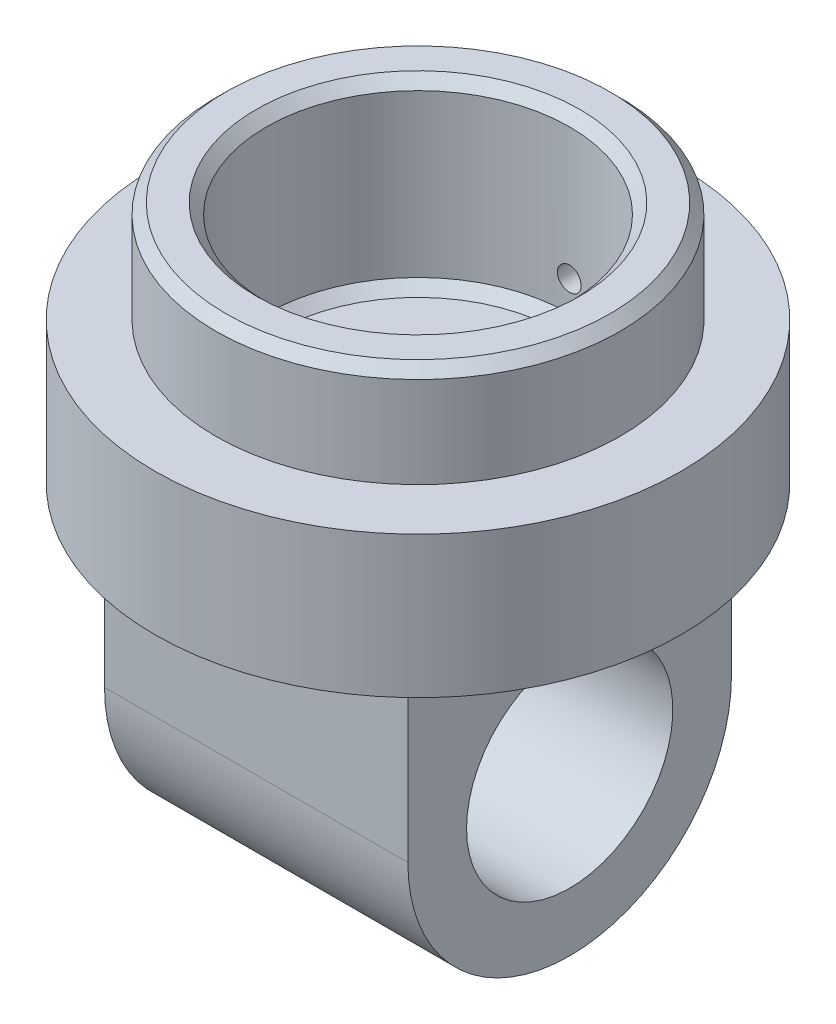
ISO-10303-21;
HEADER;
FILE_DESCRIPTION(('STEP AP214'),'2;1');
FILE_NAME('part.step','',(''),(''),'','','');
FILE_SCHEMA(('AUTOMOTIVE_DESIGN { 1 0 10303 214 1 1 1 1 }'));
ENDSEC;
DATA;
#1=APPLICATION_CONTEXT('core data for automotive mechanical design processes');
#2=APPLICATION_PROTOCOL_DEFINITION('international standard','automotive_design',2000,#1);
#3=PRODUCT_CONTEXT('',#1,'mechanical');
#4=PRODUCT('Part','Part','',(#3));
#5=PRODUCT_RELATED_PRODUCT_CATEGORY('part','',(#4));
#6=PRODUCT_DEFINITION_FORMATION('','',#4);
#7=PRODUCT_DEFINITION_CONTEXT('part definition',#1,'design');
#8=PRODUCT_DEFINITION('design','',#6,#7);
#9=PRODUCT_DEFINITION_SHAPE('','',#8);
#10=(LENGTH_UNIT() NAMED_UNIT(*) SI_UNIT(.MILLI.,.METRE.));
#11=(NAMED_UNIT(*) PLANE_ANGLE_UNIT() SI_UNIT($,.RADIAN.));
#12=(NAMED_UNIT(*) SI_UNIT($,.STERADIAN.) SOLID_ANGLE_UNIT());
#13=UNCERTAINTY_MEASURE_WITH_UNIT(LENGTH_MEASURE(1.E-05),#10,'distance_accuracy_value','');
#14=(GEOMETRIC_REPRESENTATION_CONTEXT(3) GLOBAL_UNCERTAINTY_ASSIGNED_CONTEXT((#13)) GLOBAL_UNIT_ASSIGNED_CONTEXT((#10,
#11,#12)) REPRESENTATION_CONTEXT('',''));
#15=CARTESIAN_POINT('',(0.,0.,0.));
#16=DIRECTION('',(0.,0.,1.));
#17=DIRECTION('',(1.,0.,0.));
#18=AXIS2_PLACEMENT_3D('',#15,#16,#17);
#19=CARTESIAN_POINT('',(0.,5.,-13.));
#20=DIRECTION('',(0.,0.,1.));
#21=DIRECTION('',(1.,0.,0.));
#22=AXIS2_PLACEMENT_3D('',#19,#20,#21);
#23=CYLINDRICAL_SURFACE('',#22,0.585);
#24=CARTESIAN_POINT('',(0.585,5.,-7.47715019241957));
#25=CARTESIAN_POINT('',(0.584998563795285,4.96719396278517,-7.47715049601209));
#26=CARTESIAN_POINT('',(0.582231139372127,4.93436541118221,-7.4773684210632));
#27=CARTESIAN_POINT('',(0.571231802858389,4.86961610780288,-7.47821659753848));
#28=CARTESIAN_POINT('',(0.562993651263335,4.83769643602828,-7.47884731975653));
#29=CARTESIAN_POINT('',(0.541292103546525,4.77571208378763,-7.48044922027061));
#30=CARTESIAN_POINT('',(0.527831611918575,4.74564638295718,-7.48142020929243));
#31=CARTESIAN_POINT('',(0.496072517566811,4.68820846464228,-7.48359299933171));
#32=CARTESIAN_POINT('',(0.477774969942067,4.66083566154501,-7.48479474999788));
#33=CARTESIAN_POINT('',(0.436816239470741,4.60949117617843,-7.48729671767479));
#34=CARTESIAN_POINT('',(0.414146372600511,4.58552643014494,-7.48859712746483));
#35=CARTESIAN_POINT('',(0.365104802897204,4.54173786788711,-7.49114811757688));
#36=CARTESIAN_POINT('',(0.338732940515813,4.52191423022762,-7.49239869574826));
#37=CARTESIAN_POINT('',(0.282995089212754,4.48694790918832,-7.49471090735017));
#38=CARTESIAN_POINT('',(0.253625360276622,4.4718111702842,-7.49577230011578));
#39=CARTESIAN_POINT('',(0.192751599788879,4.44668635189898,-7.49758448246524));
#40=CARTESIAN_POINT('',(0.161247601485989,4.43669819223158,-7.49833527688645));
#41=CARTESIAN_POINT('',(0.0970681601773989,4.42217386934481,-7.49944032397663));
#42=CARTESIAN_POINT('',(0.0643952540049419,4.41762655912719,-7.49979538730124));
#43=CARTESIAN_POINT('',(-0.00125186339859196,4.41407856704011,-7.50007170918446));
#44=CARTESIAN_POINT('',(-0.0342260696415574,4.41507779351161,-7.49999297491177));
#45=CARTESIAN_POINT('',(-0.0994642110645401,4.42258537328682,-7.49941124366731));
#46=CARTESIAN_POINT('',(-0.131729535151986,4.42908173896341,-7.49890916988167));
#47=CARTESIAN_POINT('',(-0.194710403933045,4.44738055976857,-7.49753830831495));
#48=CARTESIAN_POINT('',(-0.22542593543667,4.45918306004817,-7.4966695174134));
#49=CARTESIAN_POINT('',(-0.284473561064536,4.48777254166519,-7.49466139437315));
#50=CARTESIAN_POINT('',(-0.312803036686301,4.50456490980956,-7.49352177012418));
#51=CARTESIAN_POINT('',(-0.366245797581722,4.5426535408935,-7.4911001030236));
#52=CARTESIAN_POINT('',(-0.391359025819591,4.5639498836872,-7.48981805764709));
#53=CARTESIAN_POINT('',(-0.437726475075463,4.6105095420763,-7.48725165718064));
#54=CARTESIAN_POINT('',(-0.458970241329485,4.63578327082661,-7.48596730503178));
#55=CARTESIAN_POINT('',(-0.496915009654786,4.68954392925423,-7.48354449021343));
#56=CARTESIAN_POINT('',(-0.513616008619305,4.71803086112901,-7.4824060276437));
#57=CARTESIAN_POINT('',(-0.542000666539202,4.7774164308878,-7.48040364953063));
#58=CARTESIAN_POINT('',(-0.553683811896478,4.80831531526282,-7.47953976209354));
#59=CARTESIAN_POINT('',(-0.571693529135726,4.87164431182625,-7.47818485904934));
#60=CARTESIAN_POINT('',(-0.578020199514677,4.90407439584677,-7.47769383658584));
#61=CARTESIAN_POINT('',(-0.585124200386677,4.96945381907611,-7.47714133815574));
#62=CARTESIAN_POINT('',(-0.585916096986432,5.00240156643901,-7.4770787347091));
#63=CARTESIAN_POINT('',(-0.581966199328443,5.06796136381919,-7.4773871850025));
#64=CARTESIAN_POINT('',(-0.577224450201451,5.1005734165721,-7.47775823520578));
#65=CARTESIAN_POINT('',(-0.562353992882,5.16449444960116,-7.47889115473768));
#66=CARTESIAN_POINT('',(-0.552232057081079,5.19580501483873,-7.47965253269264));
#67=CARTESIAN_POINT('',(-0.526895428319861,5.25628332857806,-7.48147990678558));
#68=CARTESIAN_POINT('',(-0.511680663625552,5.28545104689012,-7.48254590721425));
#69=CARTESIAN_POINT('',(-0.476553306658331,5.34088243029676,-7.48486514535042));
#70=CARTESIAN_POINT('',(-0.456630992653969,5.36713991827515,-7.4861187685336));
#71=CARTESIAN_POINT('',(-0.41266812947916,5.41594311452501,-7.48867068030448));
#72=CARTESIAN_POINT('',(-0.388627518133201,5.43848876674739,-7.4899689695663));
#73=CARTESIAN_POINT('',(-0.337047611376138,5.47927787644979,-7.49246726770844));
#74=CARTESIAN_POINT('',(-0.309500828330164,5.49751188073007,-7.49366705694061));
#75=CARTESIAN_POINT('',(-0.251727933576654,5.52909528698747,-7.49583000857807));
#76=CARTESIAN_POINT('',(-0.221501845780548,5.54244473255134,-7.49679317309484));
#77=CARTESIAN_POINT('',(-0.159262470987015,5.56386378520704,-7.49837333275254));
#78=CARTESIAN_POINT('',(-0.127251219223727,5.57193927667544,-7.49899071358919));
#79=CARTESIAN_POINT('',(-0.0623221779357502,5.58260042688211,-7.49981130281043));
#80=CARTESIAN_POINT('',(-0.0294044032425068,5.585186175383,-7.50001451796704));
#81=CARTESIAN_POINT('',(0.0363099851482544,5.58479344855289,-7.49998389270456));
#82=CARTESIAN_POINT('',(0.0691066885431331,5.58182972250687,-7.49975121080337));
#83=CARTESIAN_POINT('',(0.133735108955002,5.57045288396941,-7.49887723333228));
#84=CARTESIAN_POINT('',(0.165566824535047,5.56203976336379,-7.49823593715395));
#85=CARTESIAN_POINT('',(0.227362969035672,5.54000659560835,-7.4966167189163));
#86=CARTESIAN_POINT('',(0.257327474332442,5.52638676159623,-7.49563881063642));
#87=CARTESIAN_POINT('',(0.314546876597952,5.49432853991922,-7.4934558827479));
#88=CARTESIAN_POINT('',(0.341801824113657,5.47589024216634,-7.49225086737718));
#89=CARTESIAN_POINT('',(0.392903821702217,5.43466322747998,-7.48974524877395));
#90=CARTESIAN_POINT('',(0.4167420891445,5.41186363858421,-7.48844441176582));
#91=CARTESIAN_POINT('',(0.460262523422789,5.36257997428967,-7.48589573764675));
#92=CARTESIAN_POINT('',(0.479943679462487,5.33609500538625,-7.48464791348461));
#93=CARTESIAN_POINT('',(0.514614370725447,5.28014706505876,-7.48234424556571));
#94=CARTESIAN_POINT('',(0.529595915028532,5.25067913289098,-7.48128873006177));
#95=CARTESIAN_POINT('',(0.554379609608873,5.18965831286628,-7.47949323705187));
#96=CARTESIAN_POINT('',(0.564187746256534,5.15810788255394,-7.47875289503752));
#97=CARTESIAN_POINT('',(0.575833632566769,5.10530776060821,-7.47786300645963));
#98=CARTESIAN_POINT('',(0.57926648651238,5.08439816662237,-7.47759692020826));
#99=CARTESIAN_POINT('',(0.583850130981975,5.04232883960955,-7.47724041543905));
#100=CARTESIAN_POINT('',(0.585000926755381,5.02116910715808,-7.47714999651713));
#101=CARTESIAN_POINT('',(0.585,5.,-7.47715019241957));
#102=B_SPLINE_CURVE_WITH_KNOTS('',3,(#24,#25,#26,#27,#28,#29,#30,#31,#32,#33,#34,#35,#36,#37,
#38,#39,#40,#41,#42,#43,#44,#45,#46,#47,#48,#49,#50,#51,#52,#53,#54,#55,#56,#57,#58,#59,#60,#61,
#62,#63,#64,#65,#66,#67,#68,#69,#70,#71,#72,#73,#74,#75,#76,#77,#78,#79,#80,#81,#82,#83,#84,#85,
#86,#87,#88,#89,#90,#91,#92,#93,#94,#95,#96,#97,#98,#99,#100,#101),.UNSPECIFIED.,.T.,.F.,(4,2,2,
2,2,2,2,2,2,2,2,2,2,2,2,2,2,2,2,2,2,2,2,2,2,2,2,2,2,2,2,2,2,2,2,2,2,2,4),(0.,0.098340822740405,
0.196793998783467,0.295192496720406,0.393569548839726,0.492144041665833,0.590722784152766,
0.68942604843554,0.788127775422642,0.886626938033285,0.985124472905173,1.08340776582575,
1.18169189507559,1.28008251473392,1.37847487897491,1.47712926542254,1.5757837193389,
1.6744482685423,1.77311100342357,1.87151398515881,1.96991616435449,2.06819477063224,
2.16647476125168,2.26495951514735,2.36344575603614,2.46214596436389,2.56084529193126,
2.65943430743485,2.75802171090004,2.85634746254026,2.9546733605884,3.05299523407991,
3.15131527302659,3.24988367883601,3.34847602390764,3.44723511166536,3.54587966897175,
3.60933726336905,3.67279471179456),.UNSPECIFIED.);
#103=CARTESIAN_POINT('',(0.585,5.,-7.47715019241957));
#104=VERTEX_POINT('',#103);
#105=EDGE_CURVE('E127',#104,#104,#102,.T.);
#106=ORIENTED_EDGE('',*,*,#105,.F.);
#107=EDGE_LOOP('',(#106));
#108=FACE_BOUND('',#107,.T.);
#109=CARTESIAN_POINT('',(0.,5.,-12.));
#110=DIRECTION('',(0.,0.,-1.));
#111=DIRECTION('',(-1.,0.,0.));
#112=AXIS2_PLACEMENT_3D('',#109,#110,#111);
#113=CIRCLE('',#112,0.585);
#114=CARTESIAN_POINT('',(-0.585,5.,-12.));
#115=VERTEX_POINT('',#114);
#116=EDGE_CURVE('E233',#115,#115,#113,.F.);
#117=ORIENTED_EDGE('',*,*,#116,.F.);
#118=EDGE_LOOP('',(#117));
#119=FACE_BOUND('',#118,.T.);
#120=ADVANCED_FACE('F41',(#108,#119),#23,.F.);
#121=CARTESIAN_POINT('',(0.,0.,0.));
#122=DIRECTION('',(0.,1.,0.));
#123=DIRECTION('',(0.,0.,1.));
#124=AXIS2_PLACEMENT_3D('',#121,#122,#123);
#125=PLANE('',#124);
#126=CARTESIAN_POINT('',(0.,0.,0.));
#127=DIRECTION('',(0.,1.,0.));
#128=DIRECTION('',(0.,0.,1.));
#129=AXIS2_PLACEMENT_3D('',#126,#127,#128);
#130=CIRCLE('',#129,13.);
#131=CARTESIAN_POINT('',(0.,0.,13.));
#132=VERTEX_POINT('',#131);
#133=EDGE_CURVE('E135',#132,#132,#130,.T.);
#134=ORIENTED_EDGE('',*,*,#133,.F.);
#135=EDGE_LOOP('',(#134));
#136=FACE_BOUND('',#135,.T.);
#137=DIRECTION('',(0.,0.,1.));
#138=VECTOR('',#137,1.);
#139=CARTESIAN_POINT('',(7.5,0.,-8.));
#140=LINE('',#139,#138);
#141=CARTESIAN_POINT('',(7.5,0.,-8.));
#142=VERTEX_POINT('',#141);
#143=CARTESIAN_POINT('',(7.5,0.,8.));
#144=VERTEX_POINT('',#143);
#145=EDGE_CURVE('E116',#142,#144,#140,.T.);
#146=ORIENTED_EDGE('',*,*,#145,.F.);
#147=DIRECTION('',(1.,0.,0.));
#148=VECTOR('',#147,1.);
#149=CARTESIAN_POINT('',(-7.5,0.,-8.));
#150=LINE('',#149,#148);
#151=CARTESIAN_POINT('',(-7.5,0.,-8.));
#152=VERTEX_POINT('',#151);
#153=EDGE_CURVE('E113',#152,#142,#150,.T.);
#154=ORIENTED_EDGE('',*,*,#153,.F.);
#155=DIRECTION('',(0.,0.,-1.));
#156=VECTOR('',#155,1.);
#157=CARTESIAN_POINT('',(-7.5,0.,-8.));
#158=LINE('',#157,#156);
#159=CARTESIAN_POINT('',(-7.5,0.,8.));
#160=VERTEX_POINT('',#159);
#161=EDGE_CURVE('E95',#160,#152,#158,.T.);
#162=ORIENTED_EDGE('',*,*,#161,.F.);
#163=DIRECTION('',(-1.,0.,0.));
#164=VECTOR('',#163,1.);
#165=CARTESIAN_POINT('',(-7.5,0.,8.));
#166=LINE('',#165,#164);
#167=EDGE_CURVE('E110',#144,#160,#166,.T.);
#168=ORIENTED_EDGE('',*,*,#167,.F.);
#169=EDGE_LOOP('',(#146,#154,#162,#168));
#170=FACE_BOUND('',#169,.T.);
#171=ADVANCED_FACE('F109',(#136,#170),#125,.F.);
#172=CARTESIAN_POINT('',(0.,7.,0.));
#173=DIRECTION('',(0.,-1.,0.));
#174=DIRECTION('',(0.,0.,-1.));
#175=AXIS2_PLACEMENT_3D('',#172,#173,#174);
#176=CYLINDRICAL_SURFACE('',#175,13.);
#177=CARTESIAN_POINT('',(0.,6.17,-13.));
#178=CARTESIAN_POINT('',(-0.0655770733831909,6.16999714463803,-12.999999314236));
#179=CARTESIAN_POINT('',(-0.131198302899322,6.16446817591332,-12.9994985222906));
#180=CARTESIAN_POINT('',(-0.260623766917359,6.14249421673751,-12.9975489156898));
#181=CARTESIAN_POINT('',(-0.324425880600931,6.12603698802158,-12.9960990382049));
#182=CARTESIAN_POINT('',(-0.448319998288958,6.08268748780169,-12.9924150364232));
#183=CARTESIAN_POINT('',(-0.508414131798482,6.0558012715841,-12.9901813672838));
#184=CARTESIAN_POINT('',(-0.623222676995861,5.99236818742624,-12.9851799994247));
#185=CARTESIAN_POINT('',(-0.677938205469778,5.95582333079415,-12.9824124119202));
#186=CARTESIAN_POINT('',(-0.780611480619449,5.87399437632325,-12.9766444441258));
#187=CARTESIAN_POINT('',(-0.828551176912478,5.82868766965657,-12.9736434738648));
#188=CARTESIAN_POINT('',(-0.916156970299005,5.73066908268457,-12.967751891193));
#189=CARTESIAN_POINT('',(-0.955822696815038,5.67795687087576,-12.96486128373));
#190=CARTESIAN_POINT('',(-1.02581688398996,5.5665127284956,-12.9595115069757));
#191=CARTESIAN_POINT('',(-1.05612928318576,5.50777067143939,-12.9570530829061));
#192=CARTESIAN_POINT('',(-1.10645378005146,5.38600474476321,-12.9528530245998));
#193=CARTESIAN_POINT('',(-1.12646608698249,5.32298096216208,-12.9511113758008));
#194=CARTESIAN_POINT('',(-1.1555694772364,5.19462285929898,-12.948547187062));
#195=CARTESIAN_POINT('',(-1.1646901978388,5.12929530951493,-12.947722153334));
#196=CARTESIAN_POINT('',(-1.17184309151239,4.99803178014403,-12.9470767876856));
#197=CARTESIAN_POINT('',(-1.16987550416455,4.93209581373376,-12.9472564340574));
#198=CARTESIAN_POINT('',(-1.15493210247322,4.80169068514305,-12.9485978596503));
#199=CARTESIAN_POINT('',(-1.14198855429366,4.73721779175373,-12.949756760111));
#200=CARTESIAN_POINT('',(-1.10551080863555,4.61136328494423,-12.952921607578));
#201=CARTESIAN_POINT('',(-1.08197649266668,4.54998170611845,-12.9549275640612));
#202=CARTESIAN_POINT('',(-1.02494933105865,4.43194973891682,-12.9595638174632));
#203=CARTESIAN_POINT('',(-0.991442069999227,4.37530635224795,-12.9621950170235));
#204=CARTESIAN_POINT('',(-0.915430545044213,4.26843525422681,-12.9677844822666));
#205=CARTESIAN_POINT('',(-0.872926068212017,4.21820769476268,-12.9707427556894));
#206=CARTESIAN_POINT('',(-0.779945972441402,4.12540645919818,-12.976665862664));
#207=CARTESIAN_POINT('',(-0.729442469817794,4.08286071461127,-12.9796306819926));
#208=CARTESIAN_POINT('',(-0.62199503724684,4.00684698720526,-12.985222806261));
#209=CARTESIAN_POINT('',(-0.565051101993916,3.97337901186444,-12.9878501109228));
#210=CARTESIAN_POINT('',(-0.446320624902194,3.91647236065178,-12.9924718121985));
#211=CARTESIAN_POINT('',(-0.384533454087613,3.89303498998468,-12.9944661264377));
#212=CARTESIAN_POINT('',(-0.257879048814398,3.85687475046419,-12.9975962422317));
#213=CARTESIAN_POINT('',(-0.193011888968761,3.84415162219712,-12.9987320645724));
#214=CARTESIAN_POINT('',(-0.0622808689777487,3.82981620693082,-13.0000145526394));
#215=CARTESIAN_POINT('',(0.00357872987152009,3.8281653534085,-13.0001646517608));
#216=CARTESIAN_POINT('',(0.134637718246366,3.83592021890556,-12.9994679651337));
#217=CARTESIAN_POINT('',(0.199837114963923,3.84532581734936,-12.9986211902565));
#218=CARTESIAN_POINT('',(0.327614451463973,3.87489461952363,-12.9960281600999));
#219=CARTESIAN_POINT('',(0.390196576879883,3.89503987834021,-12.994283405424));
#220=CARTESIAN_POINT('',(0.511092719713829,3.94549778027639,-12.9900903142734));
#221=CARTESIAN_POINT('',(0.569406658836038,3.97581060985352,-12.987641964896));
#222=CARTESIAN_POINT('',(0.680286190275396,4.04583961951891,-12.9823073579382));
#223=CARTESIAN_POINT('',(0.732835638774416,4.08558126953814,-12.9794199219806));
#224=CARTESIAN_POINT('',(0.830531369434532,4.17330311177066,-12.9735352777719));
#225=CARTESIAN_POINT('',(0.875677501438012,4.22128347104501,-12.9705380672957));
#226=CARTESIAN_POINT('',(0.957417969510042,4.32428845242655,-12.964761449726));
#227=CARTESIAN_POINT('',(0.993987083606716,4.37933313168645,-12.9619827005918));
#228=CARTESIAN_POINT('',(1.0573623458457,4.49480474607628,-12.9569672303592));
#229=CARTESIAN_POINT('',(1.0841686052662,4.55523161984954,-12.9547305030828));
#230=CARTESIAN_POINT('',(1.12721454207078,4.67966408330323,-12.951056197325));
#231=CARTESIAN_POINT('',(1.14346949516793,4.7436643530296,-12.9496174639847));
#232=CARTESIAN_POINT('',(1.16500107270786,4.87349934087947,-12.9476982974025));
#233=CARTESIAN_POINT('',(1.17027794712972,4.93933401719756,-12.9472178423398));
#234=CARTESIAN_POINT('',(1.16970047241508,5.07071835277752,-12.9472700073517));
#235=CARTESIAN_POINT('',(1.16388574835812,5.13626819126233,-12.9477990210702));
#236=CARTESIAN_POINT('',(1.14137293444024,5.2654560989954,-12.9498028449673));
#237=CARTESIAN_POINT('',(1.12467482948631,5.3290941655923,-12.9512776564576));
#238=CARTESIAN_POINT('',(1.08087963991472,5.45265354467565,-12.9550059342678));
#239=CARTESIAN_POINT('',(1.05378344483382,5.51257517458694,-12.9572593339792));
#240=CARTESIAN_POINT('',(0.989965512303128,5.62702572055137,-12.9622910133378));
#241=CARTESIAN_POINT('',(0.953243888988549,5.68155470053826,-12.9650692867609));
#242=CARTESIAN_POINT('',(0.871068509293346,5.78387504008517,-12.9708495182612));
#243=CARTESIAN_POINT('',(0.825585317251323,5.8316427181198,-12.9738522088748));
#244=CARTESIAN_POINT('',(0.727233598178512,5.91888674916551,-12.9797362407685));
#245=CARTESIAN_POINT('',(0.674363293806584,5.9583611010606,-12.9826175526272));
#246=CARTESIAN_POINT('',(0.562619947439171,6.02796024433651,-12.9879402478007));
#247=CARTESIAN_POINT('',(0.503734496133181,6.05806516711066,-12.9903806916874));
#248=CARTESIAN_POINT('',(0.381761733659473,6.10792108476435,-12.9945360190333));
#249=CARTESIAN_POINT('',(0.318679310821353,6.12768389542245,-12.9962517300596));
#250=CARTESIAN_POINT('',(0.212691935250171,6.15130111564081,-12.998327353203));
#251=CARTESIAN_POINT('',(0.170467113841784,6.15830377913045,-12.998951714113));
#252=CARTESIAN_POINT('',(0.0855011185890151,6.16765414481968,-12.999788260433));
#253=CARTESIAN_POINT('',(0.0427599463909341,6.17000186185687,-13.0000004471568));
#254=CARTESIAN_POINT('',(0.,6.17,-13.));
#255=B_SPLINE_CURVE_WITH_KNOTS('',3,(#177,#178,#179,#180,#181,#182,#183,#184,#185,#186,#187,
#188,#189,#190,#191,#192,#193,#194,#195,#196,#197,#198,#199,#200,#201,#202,#203,#204,#205,#206,
#207,#208,#209,#210,#211,#212,#213,#214,#215,#216,#217,#218,#219,#220,#221,#222,#223,#224,#225,
#226,#227,#228,#229,#230,#231,#232,#233,#234,#235,#236,#237,#238,#239,#240,#241,#242,#243,#244,
#245,#246,#247,#248,#249,#250,#251,#252,#253,#254),.UNSPECIFIED.,.T.,.F.,(4,2,2,2,2,2,2,2,2,2,2,
2,2,2,2,2,2,2,2,2,2,2,2,2,2,2,2,2,2,2,2,2,2,2,2,2,2,2,4),(0.,0.196575091084147,
0.393370693426118,0.590052202786204,0.786692787559258,0.983847716607804,1.18101147400549,
1.37851193917929,1.5760083916898,1.7729661996821,1.96991975209613,2.16629631697522,
2.36267507898464,2.55933908725317,2.75600775047832,2.95337771093226,3.15074783397924,
3.34814363146557,3.54553464945914,3.74223776393614,3.93893873329721,4.13531206014359,
4.33168898836988,4.5286025507387,4.72552010650896,4.92300966343918,5.12049696928921,
5.3176977202968,5.51489398084648,5.7113870708348,5.90788043331892,6.10435698991686,
6.30083121686481,6.49797741525511,6.69517112901493,6.8927802022428,7.09016301309279,
7.21834145588702,7.34651949011302),.UNSPECIFIED.);
#256=CARTESIAN_POINT('',(0.,6.17,-13.));
#257=VERTEX_POINT('',#256);
#258=EDGE_CURVE('E11',#257,#257,#255,.T.);
#259=ORIENTED_EDGE('',*,*,#258,.T.);
#260=EDGE_LOOP('',(#259));
#261=FACE_BOUND('',#260,.T.);
#262=CARTESIAN_POINT('',(0.,7.,0.));
#263=DIRECTION('',(0.,1.,0.));
#264=DIRECTION('',(0.,0.,1.));
#265=AXIS2_PLACEMENT_3D('',#262,#263,#264);
#266=CIRCLE('',#265,13.);
#267=CARTESIAN_POINT('',(0.,7.,13.));
#268=VERTEX_POINT('',#267);
#269=EDGE_CURVE('E132',#268,#268,#266,.T.);
#270=ORIENTED_EDGE('',*,*,#269,.F.);
#271=EDGE_LOOP('',(#270));
#272=FACE_BOUND('',#271,.T.);
#273=ORIENTED_EDGE('',*,*,#133,.T.);
#274=EDGE_LOOP('',(#273));
#275=FACE_BOUND('',#274,.T.);
#276=ADVANCED_FACE('F278',(#261,#272,#275),#176,.T.);
#277=CARTESIAN_POINT('',(0.,7.,0.));
#278=DIRECTION('',(0.,1.,0.));
#279=DIRECTION('',(0.,0.,1.));
#280=AXIS2_PLACEMENT_3D('',#277,#278,#279);
#281=PLANE('',#280);
#282=CARTESIAN_POINT('',(0.,7.,0.));
#283=DIRECTION('',(0.,1.,0.));
#284=DIRECTION('',(0.,0.,1.));
#285=AXIS2_PLACEMENT_3D('',#282,#283,#284);
#286=CIRCLE('',#285,10.);
#287=CARTESIAN_POINT('',(0.,7.,10.));
#288=VERTEX_POINT('',#287);
#289=EDGE_CURVE('E128',#288,#288,#286,.T.);
#290=ORIENTED_EDGE('',*,*,#289,.F.);
#291=EDGE_LOOP('',(#290));
#292=FACE_BOUND('',#291,.T.);
#293=ORIENTED_EDGE('',*,*,#269,.T.);
#294=EDGE_LOOP('',(#293));
#295=FACE_BOUND('',#294,.T.);
#296=ADVANCED_FACE('F281',(#292,#295),#281,.T.);
#297=CARTESIAN_POINT('',(0.,12.,0.));
#298=DIRECTION('',(0.,-1.,0.));
#299=DIRECTION('',(0.,0.,-1.));
#300=AXIS2_PLACEMENT_3D('',#297,#298,#299);
#301=CYLINDRICAL_SURFACE('',#300,10.);
#302=CARTESIAN_POINT('',(0.,11.5,0.));
#303=DIRECTION('',(0.,1.,0.));
#304=DIRECTION('',(0.,0.,1.));
#305=AXIS2_PLACEMENT_3D('',#302,#303,#304);
#306=CIRCLE('',#305,10.);
#307=CARTESIAN_POINT('',(0.,11.5,10.));
#308=VERTEX_POINT('',#307);
#309=EDGE_CURVE('E143',#308,#308,#306,.F.);
#310=ORIENTED_EDGE('',*,*,#309,.T.);
#311=EDGE_LOOP('',(#310));
#312=FACE_BOUND('',#311,.T.);
#313=ORIENTED_EDGE('',*,*,#289,.T.);
#314=EDGE_LOOP('',(#313));
#315=FACE_BOUND('',#314,.T.);
#316=ADVANCED_FACE('F364',(#312,#315),#301,.T.);
#317=CARTESIAN_POINT('',(0.,12.,0.));
#318=DIRECTION('',(0.,1.,0.));
#319=DIRECTION('',(0.,0.,1.));
#320=AXIS2_PLACEMENT_3D('',#317,#318,#319);
#321=PLANE('',#320);
#322=CARTESIAN_POINT('',(0.,12.,0.));
#323=DIRECTION('',(0.,1.,0.));
#324=DIRECTION('',(0.,0.,1.));
#325=AXIS2_PLACEMENT_3D('',#322,#323,#324);
#326=CIRCLE('',#325,9.5);
#327=CARTESIAN_POINT('',(0.,12.,9.5));
#328=VERTEX_POINT('',#327);
#329=EDGE_CURVE('E140',#328,#328,#326,.T.);
#330=ORIENTED_EDGE('',*,*,#329,.T.);
#331=EDGE_LOOP('',(#330));
#332=FACE_BOUND('',#331,.T.);
#333=CARTESIAN_POINT('',(0.,12.,0.));
#334=DIRECTION('',(0.,1.,0.));
#335=DIRECTION('',(0.,0.,1.));
#336=AXIS2_PLACEMENT_3D('',#333,#334,#335);
#337=CIRCLE('',#336,8.);
#338=CARTESIAN_POINT('',(0.,12.,8.));
#339=VERTEX_POINT('',#338);
#340=EDGE_CURVE('E131',#339,#339,#337,.F.);
#341=ORIENTED_EDGE('',*,*,#340,.T.);
#342=EDGE_LOOP('',(#341));
#343=FACE_BOUND('',#342,.T.);
#344=ADVANCED_FACE('F186',(#332,#343),#321,.T.);
#345=CARTESIAN_POINT('',(0.,3.,0.));
#346=DIRECTION('',(0.,1.,0.));
#347=DIRECTION('',(0.,0.,1.));
#348=AXIS2_PLACEMENT_3D('',#345,#346,#347);
#349=CYLINDRICAL_SURFACE('',#348,7.5);
#350=ORIENTED_EDGE('',*,*,#105,.T.);
#351=EDGE_LOOP('',(#350));
#352=FACE_BOUND('',#351,.T.);
#353=CARTESIAN_POINT('',(0.,3.49999999999999,0.));
#354=DIRECTION('',(0.,1.,0.));
#355=DIRECTION('',(0.,0.,1.));
#356=AXIS2_PLACEMENT_3D('',#353,#354,#355);
#357=CIRCLE('',#356,7.5);
#358=CARTESIAN_POINT('',(0.,3.49999999999999,7.5));
#359=VERTEX_POINT('',#358);
#360=EDGE_CURVE('E152',#359,#359,#357,.F.);
#361=ORIENTED_EDGE('',*,*,#360,.T.);
#362=EDGE_LOOP('',(#361));
#363=FACE_BOUND('',#362,.T.);
#364=CARTESIAN_POINT('',(0.,11.5,0.));
#365=DIRECTION('',(0.,1.,0.));
#366=DIRECTION('',(0.,0.,1.));
#367=AXIS2_PLACEMENT_3D('',#364,#365,#366);
#368=CIRCLE('',#367,7.5);
#369=CARTESIAN_POINT('',(0.,11.5,7.5));
#370=VERTEX_POINT('',#369);
#371=EDGE_CURVE('E149',#370,#370,#368,.T.);
#372=ORIENTED_EDGE('',*,*,#371,.T.);
#373=EDGE_LOOP('',(#372));
#374=FACE_BOUND('',#373,.T.);
#375=ADVANCED_FACE('F164',(#352,#363,#374),#349,.F.);
#376=CARTESIAN_POINT('',(0.,3.,0.));
#377=DIRECTION('',(0.,1.,0.));
#378=DIRECTION('',(0.,0.,1.));
#379=AXIS2_PLACEMENT_3D('',#376,#377,#378);
#380=PLANE('',#379);
#381=CARTESIAN_POINT('',(0.,3.,0.));
#382=DIRECTION('',(0.,1.,0.));
#383=DIRECTION('',(0.,0.,1.));
#384=AXIS2_PLACEMENT_3D('',#381,#382,#383);
#385=CIRCLE('',#384,7.);
#386=CARTESIAN_POINT('',(0.,3.,7.));
#387=VERTEX_POINT('',#386);
#388=EDGE_CURVE('E146',#387,#387,#385,.T.);
#389=ORIENTED_EDGE('',*,*,#388,.T.);
#390=EDGE_LOOP('',(#389));
#391=FACE_BOUND('',#390,.T.);
#392=ADVANCED_FACE('F174',(#391),#380,.T.);
#393=CARTESIAN_POINT('',(0.,12.,0.));
#394=DIRECTION('',(0.,-1.,0.));
#395=DIRECTION('',(0.,0.,-1.));
#396=AXIS2_PLACEMENT_3D('',#393,#394,#395);
#397=CONICAL_SURFACE('',#396,9.5,0.785398163397441);
#398=ORIENTED_EDGE('',*,*,#309,.F.);
#399=EDGE_LOOP('',(#398));
#400=FACE_BOUND('',#399,.T.);
#401=ORIENTED_EDGE('',*,*,#329,.F.);
#402=EDGE_LOOP('',(#401));
#403=FACE_BOUND('',#402,.T.);
#404=ADVANCED_FACE('F176',(#400,#403),#397,.T.);
#405=CARTESIAN_POINT('',(0.,3.,0.));
#406=DIRECTION('',(0.,1.,0.));
#407=DIRECTION('',(0.,0.,1.));
#408=AXIS2_PLACEMENT_3D('',#405,#406,#407);
#409=CONICAL_SURFACE('',#408,7.,0.785398163397457);
#410=ORIENTED_EDGE('',*,*,#360,.F.);
#411=EDGE_LOOP('',(#410));
#412=FACE_BOUND('',#411,.T.);
#413=ORIENTED_EDGE('',*,*,#388,.F.);
#414=EDGE_LOOP('',(#413));
#415=FACE_BOUND('',#414,.T.);
#416=ADVANCED_FACE('F182',(#412,#415),#409,.F.);
#417=CARTESIAN_POINT('',(0.,11.5,0.));
#418=DIRECTION('',(0.,1.,0.));
#419=DIRECTION('',(0.,0.,1.));
#420=AXIS2_PLACEMENT_3D('',#417,#418,#419);
#421=CONICAL_SURFACE('',#420,7.5,0.785398163397452);
#422=ORIENTED_EDGE('',*,*,#340,.F.);
#423=EDGE_LOOP('',(#422));
#424=FACE_BOUND('',#423,.T.);
#425=ORIENTED_EDGE('',*,*,#371,.F.);
#426=EDGE_LOOP('',(#425));
#427=FACE_BOUND('',#426,.T.);
#428=ADVANCED_FACE('F191',(#424,#427),#421,.F.);
#429=CARTESIAN_POINT('',(7.5,-16.5,-8.));
#430=DIRECTION('',(-1.,0.,0.));
#431=DIRECTION('',(0.,0.,1.));
#432=AXIS2_PLACEMENT_3D('',#429,#430,#431);
#433=PLANE('',#432);
#434=CARTESIAN_POINT('',(7.5,-8.5,0.));
#435=DIRECTION('',(-1.,0.,0.));
#436=DIRECTION('',(0.,0.,1.));
#437=AXIS2_PLACEMENT_3D('',#434,#435,#436);
#438=CIRCLE('',#437,5.1);
#439=CARTESIAN_POINT('',(7.5,-8.5,5.1));
#440=VERTEX_POINT('',#439);
#441=EDGE_CURVE('E232',#440,#440,#438,.F.);
#442=ORIENTED_EDGE('',*,*,#441,.F.);
#443=EDGE_LOOP('',(#442));
#444=FACE_BOUND('',#443,.T.);
#445=DIRECTION('',(0.,1.,0.));
#446=VECTOR('',#445,1.);
#447=CARTESIAN_POINT('',(7.5,-16.5,8.));
#448=LINE('',#447,#446);
#449=CARTESIAN_POINT('',(7.5,-8.5,8.));
#450=VERTEX_POINT('',#449);
#451=EDGE_CURVE('E102',#450,#144,#448,.T.);
#452=ORIENTED_EDGE('',*,*,#451,.F.);
#453=CARTESIAN_POINT('',(7.5,-8.5,0.));
#454=DIRECTION('',(-1.,0.,0.));
#455=DIRECTION('',(0.,0.,1.));
#456=AXIS2_PLACEMENT_3D('',#453,#454,#455);
#457=CIRCLE('',#456,8.);
#458=CARTESIAN_POINT('',(7.5,-16.5,0.));
#459=VERTEX_POINT('',#458);
#460=EDGE_CURVE('E66',#450,#459,#457,.F.);
#461=ORIENTED_EDGE('',*,*,#460,.T.);
#462=CARTESIAN_POINT('',(7.5,-8.5,0.));
#463=DIRECTION('',(-1.,0.,0.));
#464=DIRECTION('',(0.,0.,1.));
#465=AXIS2_PLACEMENT_3D('',#462,#463,#464);
#466=CIRCLE('',#465,8.);
#467=CARTESIAN_POINT('',(7.5,-8.5,-8.));
#468=VERTEX_POINT('',#467);
#469=EDGE_CURVE('E61',#459,#468,#466,.F.);
#470=ORIENTED_EDGE('',*,*,#469,.T.);
#471=DIRECTION('',(0.,1.,0.));
#472=VECTOR('',#471,1.);
#473=CARTESIAN_POINT('',(7.5,-16.5,-8.));
#474=LINE('',#473,#472);
#475=EDGE_CURVE('E123',#468,#142,#474,.T.);
#476=ORIENTED_EDGE('',*,*,#475,.T.);
#477=ORIENTED_EDGE('',*,*,#145,.T.);
#478=EDGE_LOOP('',(#452,#461,#470,#476,#477));
#479=FACE_BOUND('',#478,.T.);
#480=ADVANCED_FACE('F172',(#444,#479),#433,.F.);
#481=CARTESIAN_POINT('',(-7.5,-16.5,8.));
#482=DIRECTION('',(0.,0.,-1.));
#483=DIRECTION('',(-1.,0.,0.));
#484=AXIS2_PLACEMENT_3D('',#481,#482,#483);
#485=PLANE('',#484);
#486=DIRECTION('',(0.,1.,0.));
#487=VECTOR('',#486,1.);
#488=CARTESIAN_POINT('',(-7.5,-16.5,8.));
#489=LINE('',#488,#487);
#490=CARTESIAN_POINT('',(-7.5,-8.5,8.));
#491=VERTEX_POINT('',#490);
#492=EDGE_CURVE('E91',#491,#160,#489,.T.);
#493=ORIENTED_EDGE('',*,*,#492,.F.);
#494=DIRECTION('',(-1.,0.,0.));
#495=VECTOR('',#494,1.);
#496=CARTESIAN_POINT('',(-7.5,-8.5,8.));
#497=LINE('',#496,#495);
#498=EDGE_CURVE('E222',#491,#450,#497,.F.);
#499=ORIENTED_EDGE('',*,*,#498,.T.);
#500=ORIENTED_EDGE('',*,*,#451,.T.);
#501=ORIENTED_EDGE('',*,*,#167,.T.);
#502=EDGE_LOOP('',(#493,#499,#500,#501));
#503=FACE_BOUND('',#502,.T.);
#504=ADVANCED_FACE('F115',(#503),#485,.F.);
#505=CARTESIAN_POINT('',(-7.5,-16.5,-8.));
#506=DIRECTION('',(1.,0.,0.));
#507=DIRECTION('',(0.,0.,-1.));
#508=AXIS2_PLACEMENT_3D('',#505,#506,#507);
#509=PLANE('',#508);
#510=CARTESIAN_POINT('',(-7.5,-8.5,0.));
#511=DIRECTION('',(-1.,0.,0.));
#512=DIRECTION('',(0.,0.,1.));
#513=AXIS2_PLACEMENT_3D('',#510,#511,#512);
#514=CIRCLE('',#513,5.1);
#515=CARTESIAN_POINT('',(-7.5,-8.5,5.1));
#516=VERTEX_POINT('',#515);
#517=EDGE_CURVE('E235',#516,#516,#514,.T.);
#518=ORIENTED_EDGE('',*,*,#517,.F.);
#519=EDGE_LOOP('',(#518));
#520=FACE_BOUND('',#519,.T.);
#521=CARTESIAN_POINT('',(-7.5,-8.5,0.));
#522=DIRECTION('',(1.,0.,0.));
#523=DIRECTION('',(0.,0.,-1.));
#524=AXIS2_PLACEMENT_3D('',#521,#522,#523);
#525=CIRCLE('',#524,8.);
#526=CARTESIAN_POINT('',(-7.5,-8.5,-8.));
#527=VERTEX_POINT('',#526);
#528=CARTESIAN_POINT('',(-7.5,-16.5,0.));
#529=VERTEX_POINT('',#528);
#530=EDGE_CURVE('E155',#527,#529,#525,.F.);
#531=ORIENTED_EDGE('',*,*,#530,.T.);
#532=CARTESIAN_POINT('',(-7.5,-8.5,0.));
#533=DIRECTION('',(1.,0.,0.));
#534=DIRECTION('',(0.,0.,-1.));
#535=AXIS2_PLACEMENT_3D('',#532,#533,#534);
#536=CIRCLE('',#535,8.);
#537=EDGE_CURVE('E97',#529,#491,#536,.F.);
#538=ORIENTED_EDGE('',*,*,#537,.T.);
#539=ORIENTED_EDGE('',*,*,#492,.T.);
#540=ORIENTED_EDGE('',*,*,#161,.T.);
#541=DIRECTION('',(0.,1.,0.));
#542=VECTOR('',#541,1.);
#543=CARTESIAN_POINT('',(-7.5,-16.5,-8.));
#544=LINE('',#543,#542);
#545=EDGE_CURVE('E103',#527,#152,#544,.T.);
#546=ORIENTED_EDGE('',*,*,#545,.F.);
#547=EDGE_LOOP('',(#531,#538,#539,#540,#546));
#548=FACE_BOUND('',#547,.T.);
#549=ADVANCED_FACE('F93',(#520,#548),#509,.F.);
#550=CARTESIAN_POINT('',(-7.5,-16.5,-8.));
#551=DIRECTION('',(0.,0.,1.));
#552=DIRECTION('',(1.,0.,0.));
#553=AXIS2_PLACEMENT_3D('',#550,#551,#552);
#554=PLANE('',#553);
#555=ORIENTED_EDGE('',*,*,#475,.F.);
#556=DIRECTION('',(1.,0.,0.));
#557=VECTOR('',#556,1.);
#558=CARTESIAN_POINT('',(-7.5,-8.5,-8.));
#559=LINE('',#558,#557);
#560=EDGE_CURVE('E54',#468,#527,#559,.F.);
#561=ORIENTED_EDGE('',*,*,#560,.T.);
#562=ORIENTED_EDGE('',*,*,#545,.T.);
#563=ORIENTED_EDGE('',*,*,#153,.T.);
#564=EDGE_LOOP('',(#555,#561,#562,#563));
#565=FACE_BOUND('',#564,.T.);
#566=ADVANCED_FACE('F219',(#565),#554,.F.);
#567=CARTESIAN_POINT('',(0.,-8.5,0.));
#568=DIRECTION('',(1.,0.,0.));
#569=DIRECTION('',(0.,0.,-1.));
#570=AXIS2_PLACEMENT_3D('',#567,#568,#569);
#571=CYLINDRICAL_SURFACE('',#570,8.);
#572=ORIENTED_EDGE('',*,*,#560,.F.);
#573=ORIENTED_EDGE('',*,*,#469,.F.);
#574=DIRECTION('',(1.,0.,0.));
#575=VECTOR('',#574,1.);
#576=CARTESIAN_POINT('',(0.,-16.5,0.));
#577=LINE('',#576,#575);
#578=EDGE_CURVE('E118',#529,#459,#577,.T.);
#579=ORIENTED_EDGE('',*,*,#578,.F.);
#580=ORIENTED_EDGE('',*,*,#530,.F.);
#581=EDGE_LOOP('',(#572,#573,#579,#580));
#582=FACE_BOUND('',#581,.T.);
#583=ADVANCED_FACE('F43',(#582),#571,.T.);
#584=CARTESIAN_POINT('',(0.,-8.5,0.));
#585=DIRECTION('',(-1.,0.,0.));
#586=DIRECTION('',(0.,0.,1.));
#587=AXIS2_PLACEMENT_3D('',#584,#585,#586);
#588=CYLINDRICAL_SURFACE('',#587,8.);
#589=ORIENTED_EDGE('',*,*,#460,.F.);
#590=ORIENTED_EDGE('',*,*,#498,.F.);
#591=ORIENTED_EDGE('',*,*,#537,.F.);
#592=ORIENTED_EDGE('',*,*,#578,.T.);
#593=EDGE_LOOP('',(#589,#590,#591,#592));
#594=FACE_BOUND('',#593,.T.);
#595=ADVANCED_FACE('F207',(#594),#588,.T.);
#596=CARTESIAN_POINT('',(21.9249783362056,-8.5,0.));
#597=DIRECTION('',(-1.,0.,0.));
#598=DIRECTION('',(0.,0.,1.));
#599=AXIS2_PLACEMENT_3D('',#596,#597,#598);
#600=CYLINDRICAL_SURFACE('',#599,5.1);
#601=ORIENTED_EDGE('',*,*,#441,.T.);
#602=EDGE_LOOP('',(#601));
#603=FACE_BOUND('',#602,.T.);
#604=ORIENTED_EDGE('',*,*,#517,.T.);
#605=EDGE_LOOP('',(#604));
#606=FACE_BOUND('',#605,.T.);
#607=ADVANCED_FACE('F209',(#603,#606),#600,.F.);
#608=CARTESIAN_POINT('',(0.,5.,-12.));
#609=DIRECTION('',(0.,0.,-1.));
#610=DIRECTION('',(-1.,0.,0.));
#611=AXIS2_PLACEMENT_3D('',#608,#609,#610);
#612=CYLINDRICAL_SURFACE('',#611,1.17);
#613=CARTESIAN_POINT('',(0.,5.,-12.));
#614=DIRECTION('',(0.,0.,-1.));
#615=DIRECTION('',(-1.,0.,0.));
#616=AXIS2_PLACEMENT_3D('',#613,#614,#615);
#617=CIRCLE('',#616,1.17);
#618=CARTESIAN_POINT('',(-1.17,5.,-12.));
#619=VERTEX_POINT('',#618);
#620=EDGE_CURVE('E236',#619,#619,#617,.T.);
#621=ORIENTED_EDGE('',*,*,#620,.F.);
#622=EDGE_LOOP('',(#621));
#623=FACE_BOUND('',#622,.T.);
#624=ORIENTED_EDGE('',*,*,#258,.F.);
#625=EDGE_LOOP('',(#624));
#626=FACE_BOUND('',#625,.T.);
#627=ADVANCED_FACE('F216',(#623,#626),#612,.F.);
#628=CARTESIAN_POINT('',(0.,5.,-12.));
#629=DIRECTION('',(0.,0.,-1.));
#630=DIRECTION('',(-1.,0.,0.));
#631=AXIS2_PLACEMENT_3D('',#628,#629,#630);
#632=PLANE('',#631);
#633=ORIENTED_EDGE('',*,*,#620,.T.);
#634=EDGE_LOOP('',(#633));
#635=FACE_BOUND('',#634,.T.);
#636=ORIENTED_EDGE('',*,*,#116,.T.);
#637=EDGE_LOOP('',(#636));
#638=FACE_BOUND('',#637,.T.);
#639=ADVANCED_FACE('F263',(#635,#638),#632,.T.);
#640=CLOSED_SHELL('',(#120,#171,#276,#296,#316,#344,#375,#392,#404,#416,#428,#480,#504,#549,
#566,#583,#595,#607,#627,#639));
#641=MANIFOLD_SOLID_BREP('B2',#640);
#642=ADVANCED_BREP_SHAPE_REPRESENTATION('',(#18,#641),#14);
#643=SHAPE_DEFINITION_REPRESENTATION(#9,#642);
ENDSEC;
END-ISO-10303-21;
